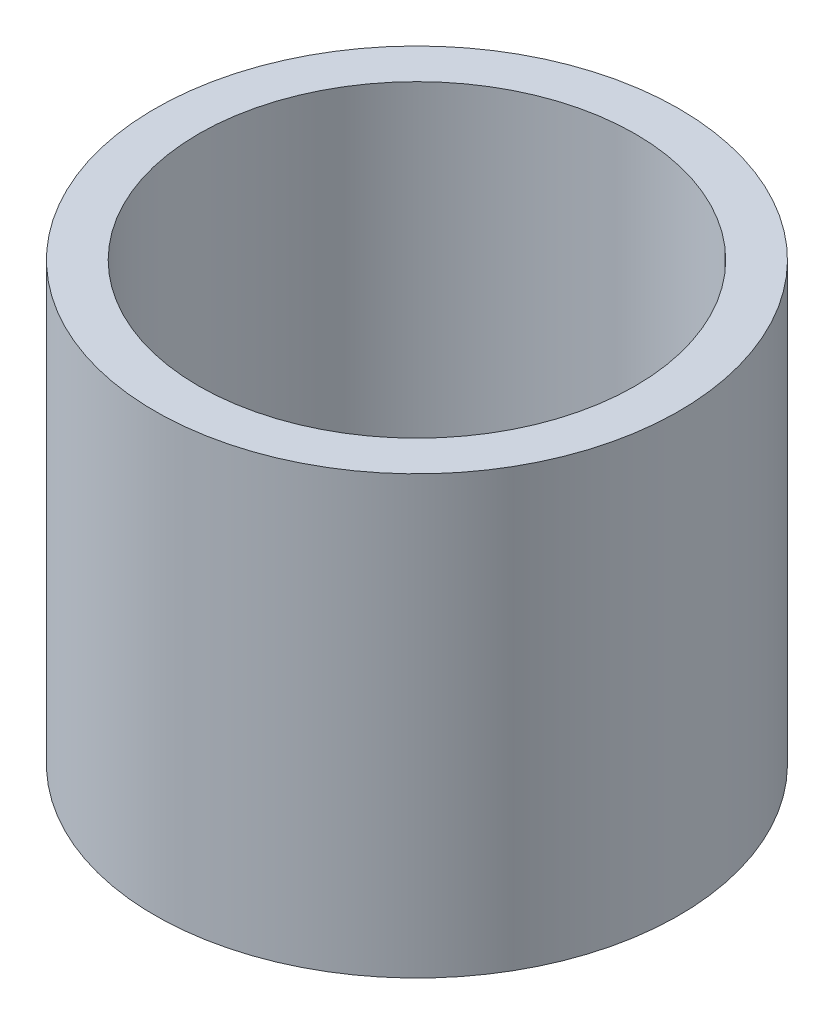
ISO-10303-21;
HEADER;
FILE_DESCRIPTION(('STEP AP214'),'2;1');
FILE_NAME('part.step','',(''),(''),'','','');
FILE_SCHEMA(('AUTOMOTIVE_DESIGN { 1 0 10303 214 1 1 1 1 }'));
ENDSEC;
DATA;
#1=APPLICATION_CONTEXT('core data for automotive mechanical design processes');
#2=APPLICATION_PROTOCOL_DEFINITION('international standard','automotive_design',2000,#1);
#3=PRODUCT_CONTEXT('',#1,'mechanical');
#4=PRODUCT('Part','Part','',(#3));
#5=PRODUCT_RELATED_PRODUCT_CATEGORY('part','',(#4));
#6=PRODUCT_DEFINITION_FORMATION('','',#4);
#7=PRODUCT_DEFINITION_CONTEXT('part definition',#1,'design');
#8=PRODUCT_DEFINITION('design','',#6,#7);
#9=PRODUCT_DEFINITION_SHAPE('','',#8);
#10=(LENGTH_UNIT() NAMED_UNIT(*) SI_UNIT(.MILLI.,.METRE.));
#11=(NAMED_UNIT(*) PLANE_ANGLE_UNIT() SI_UNIT($,.RADIAN.));
#12=(NAMED_UNIT(*) SI_UNIT($,.STERADIAN.) SOLID_ANGLE_UNIT());
#13=UNCERTAINTY_MEASURE_WITH_UNIT(LENGTH_MEASURE(1.E-05),#10,'distance_accuracy_value','');
#14=(GEOMETRIC_REPRESENTATION_CONTEXT(3) GLOBAL_UNCERTAINTY_ASSIGNED_CONTEXT((#13)) GLOBAL_UNIT_ASSIGNED_CONTEXT((#10,
#11,#12)) REPRESENTATION_CONTEXT('',''));
#15=CARTESIAN_POINT('',(0.,0.,0.));
#16=DIRECTION('',(0.,0.,1.));
#17=DIRECTION('',(1.,0.,0.));
#18=AXIS2_PLACEMENT_3D('',#15,#16,#17);
#19=CARTESIAN_POINT('',(0.,19.05,0.));
#20=DIRECTION('',(0.,1.,0.));
#21=DIRECTION('',(0.,0.,1.));
#22=AXIS2_PLACEMENT_3D('',#19,#20,#21);
#23=PLANE('',#22);
#24=CARTESIAN_POINT('',(0.,19.05,0.));
#25=DIRECTION('',(0.,1.,0.));
#26=DIRECTION('',(0.,0.,1.));
#27=AXIS2_PLACEMENT_3D('',#24,#25,#26);
#28=CIRCLE('',#27,11.43);
#29=CARTESIAN_POINT('',(0.,19.05,-11.43));
#30=VERTEX_POINT('',#29);
#31=EDGE_CURVE('E10',#30,#30,#28,.T.);
#32=ORIENTED_EDGE('',*,*,#31,.T.);
#33=EDGE_LOOP('',(#32));
#34=FACE_BOUND('',#33,.T.);
#35=CARTESIAN_POINT('',(0.,19.05,0.));
#36=DIRECTION('',(0.,1.,0.));
#37=DIRECTION('',(0.,0.,1.));
#38=AXIS2_PLACEMENT_3D('',#35,#36,#37);
#39=CIRCLE('',#38,9.525);
#40=CARTESIAN_POINT('',(0.,19.05,-9.525));
#41=VERTEX_POINT('',#40);
#42=EDGE_CURVE('E42',#41,#41,#39,.T.);
#43=ORIENTED_EDGE('',*,*,#42,.F.);
#44=EDGE_LOOP('',(#43));
#45=FACE_BOUND('',#44,.T.);
#46=ADVANCED_FACE('F31',(#34,#45),#23,.T.);
#47=CARTESIAN_POINT('',(0.,0.,0.));
#48=DIRECTION('',(0.,1.,0.));
#49=DIRECTION('',(0.,0.,1.));
#50=AXIS2_PLACEMENT_3D('',#47,#48,#49);
#51=PLANE('',#50);
#52=CARTESIAN_POINT('',(0.,0.,0.));
#53=DIRECTION('',(0.,1.,0.));
#54=DIRECTION('',(0.,0.,1.));
#55=AXIS2_PLACEMENT_3D('',#52,#53,#54);
#56=CIRCLE('',#55,11.43);
#57=CARTESIAN_POINT('',(0.,0.,-11.43));
#58=VERTEX_POINT('',#57);
#59=EDGE_CURVE('E35',#58,#58,#56,.T.);
#60=ORIENTED_EDGE('',*,*,#59,.F.);
#61=EDGE_LOOP('',(#60));
#62=FACE_BOUND('',#61,.T.);
#63=CARTESIAN_POINT('',(0.,0.,0.));
#64=DIRECTION('',(0.,1.,0.));
#65=DIRECTION('',(0.,0.,1.));
#66=AXIS2_PLACEMENT_3D('',#63,#64,#65);
#67=CIRCLE('',#66,9.525);
#68=CARTESIAN_POINT('',(0.,0.,-9.525));
#69=VERTEX_POINT('',#68);
#70=EDGE_CURVE('E44',#69,#69,#67,.T.);
#71=ORIENTED_EDGE('',*,*,#70,.T.);
#72=EDGE_LOOP('',(#71));
#73=FACE_BOUND('',#72,.T.);
#74=ADVANCED_FACE('F54',(#62,#73),#51,.F.);
#75=CARTESIAN_POINT('',(0.,19.05,0.));
#76=DIRECTION('',(0.,-1.,0.));
#77=DIRECTION('',(0.,0.,-1.));
#78=AXIS2_PLACEMENT_3D('',#75,#76,#77);
#79=CYLINDRICAL_SURFACE('',#78,11.43);
#80=CARTESIAN_POINT('',(0.,19.05,-11.43));
#81=CARTESIAN_POINT('',(0.,18.8515625,-11.43));
#82=CARTESIAN_POINT('',(0.,18.653125,-11.43));
#83=CARTESIAN_POINT('',(0.,18.25625,-11.43));
#84=CARTESIAN_POINT('',(0.,18.0578125,-11.43));
#85=CARTESIAN_POINT('',(0.,17.6609375,-11.43));
#86=CARTESIAN_POINT('',(0.,17.4625,-11.43));
#87=CARTESIAN_POINT('',(0.,17.065625,-11.43));
#88=CARTESIAN_POINT('',(0.,16.8671875,-11.43));
#89=CARTESIAN_POINT('',(0.,16.4703125,-11.43));
#90=CARTESIAN_POINT('',(0.,16.271875,-11.43));
#91=CARTESIAN_POINT('',(0.,15.875,-11.43));
#92=CARTESIAN_POINT('',(0.,15.6765625,-11.43));
#93=CARTESIAN_POINT('',(0.,15.2796875,-11.43));
#94=CARTESIAN_POINT('',(0.,15.08125,-11.43));
#95=CARTESIAN_POINT('',(0.,14.684375,-11.43));
#96=CARTESIAN_POINT('',(0.,14.4859375,-11.43));
#97=CARTESIAN_POINT('',(0.,14.0890625,-11.43));
#98=CARTESIAN_POINT('',(0.,13.890625,-11.43));
#99=CARTESIAN_POINT('',(0.,13.49375,-11.43));
#100=CARTESIAN_POINT('',(0.,13.2953125,-11.43));
#101=CARTESIAN_POINT('',(0.,12.8984375,-11.43));
#102=CARTESIAN_POINT('',(0.,12.7,-11.43));
#103=CARTESIAN_POINT('',(0.,12.303125,-11.43));
#104=CARTESIAN_POINT('',(0.,12.1046875,-11.43));
#105=CARTESIAN_POINT('',(0.,11.7078125,-11.43));
#106=CARTESIAN_POINT('',(0.,11.509375,-11.43));
#107=CARTESIAN_POINT('',(0.,11.1125,-11.43));
#108=CARTESIAN_POINT('',(0.,10.9140625,-11.43));
#109=CARTESIAN_POINT('',(0.,10.5171875,-11.43));
#110=CARTESIAN_POINT('',(0.,10.31875,-11.43));
#111=CARTESIAN_POINT('',(0.,9.921875,-11.43));
#112=CARTESIAN_POINT('',(0.,9.7234375,-11.43));
#113=CARTESIAN_POINT('',(0.,9.3265625,-11.43));
#114=CARTESIAN_POINT('',(0.,9.128125,-11.43));
#115=CARTESIAN_POINT('',(0.,8.73125,-11.43));
#116=CARTESIAN_POINT('',(0.,8.5328125,-11.43));
#117=CARTESIAN_POINT('',(0.,8.1359375,-11.43));
#118=CARTESIAN_POINT('',(0.,7.9375,-11.43));
#119=CARTESIAN_POINT('',(0.,7.540625,-11.43));
#120=CARTESIAN_POINT('',(0.,7.3421875,-11.43));
#121=CARTESIAN_POINT('',(0.,6.9453125,-11.43));
#122=CARTESIAN_POINT('',(0.,6.746875,-11.43));
#123=CARTESIAN_POINT('',(0.,6.35,-11.43));
#124=CARTESIAN_POINT('',(0.,6.1515625,-11.43));
#125=CARTESIAN_POINT('',(0.,5.7546875,-11.43));
#126=CARTESIAN_POINT('',(0.,5.55625,-11.43));
#127=CARTESIAN_POINT('',(0.,5.159375,-11.43));
#128=CARTESIAN_POINT('',(0.,4.9609375,-11.43));
#129=CARTESIAN_POINT('',(0.,4.5640625,-11.43));
#130=CARTESIAN_POINT('',(0.,4.365625,-11.43));
#131=CARTESIAN_POINT('',(0.,3.96875,-11.43));
#132=CARTESIAN_POINT('',(0.,3.7703125,-11.43));
#133=CARTESIAN_POINT('',(0.,3.3734375,-11.43));
#134=CARTESIAN_POINT('',(0.,3.175,-11.43));
#135=CARTESIAN_POINT('',(0.,2.778125,-11.43));
#136=CARTESIAN_POINT('',(0.,2.5796875,-11.43));
#137=CARTESIAN_POINT('',(0.,2.1828125,-11.43));
#138=CARTESIAN_POINT('',(0.,1.984375,-11.43));
#139=CARTESIAN_POINT('',(0.,1.5875,-11.43));
#140=CARTESIAN_POINT('',(0.,1.3890625,-11.43));
#141=CARTESIAN_POINT('',(0.,0.992187500000001,-11.43));
#142=CARTESIAN_POINT('',(0.,0.793750000000001,-11.43));
#143=CARTESIAN_POINT('',(0.,0.396875,-11.43));
#144=CARTESIAN_POINT('',(0.,0.1984375,-11.43));
#145=CARTESIAN_POINT('',(0.,0.,-11.43));
#146=B_SPLINE_CURVE_WITH_KNOTS('',3,(#80,#81,#82,#83,#84,#85,#86,#87,#88,#89,#90,#91,#92,#93,
#94,#95,#96,#97,#98,#99,#100,#101,#102,#103,#104,#105,#106,#107,#108,#109,#110,#111,#112,#113,
#114,#115,#116,#117,#118,#119,#120,#121,#122,#123,#124,#125,#126,#127,#128,#129,#130,#131,#132,
#133,#134,#135,#136,#137,#138,#139,#140,#141,#142,#143,#144,#145),.UNSPECIFIED.,.F.,.F.,(4,2,2,
2,2,2,2,2,2,2,2,2,2,2,2,2,2,2,2,2,2,2,2,2,2,2,2,2,2,2,2,2,4),(0.,0.595312499999997,1.190625,
1.7859375,2.38125,2.9765625,3.571875,4.1671875,4.7625,5.3578125,5.953125,6.5484375,7.14375,
7.7390625,8.334375,8.9296875,9.525,10.1203125,10.715625,11.3109375,11.90625,12.5015625,
13.096875,13.6921875,14.2875,14.8828125,15.478125,16.0734375,16.66875,17.2640625,17.859375,
18.4546875,19.05),.UNSPECIFIED.);
#147=EDGE_CURVE('BSEAM33',#30,#58,#146,.T.);
#148=ORIENTED_EDGE('',*,*,#31,.F.);
#149=ORIENTED_EDGE('',*,*,#59,.T.);
#150=ORIENTED_EDGE('',*,*,#147,.T.);
#151=ORIENTED_EDGE('',*,*,#147,.F.);
#152=EDGE_LOOP('',(#148,#150,#149,#151));
#153=FACE_BOUND('',#152,.T.);
#154=ADVANCED_FACE('F33',(#153),#79,.T.);
#155=CARTESIAN_POINT('',(0.,19.05,0.));
#156=DIRECTION('',(0.,-1.,0.));
#157=DIRECTION('',(0.,0.,-1.));
#158=AXIS2_PLACEMENT_3D('',#155,#156,#157);
#159=CYLINDRICAL_SURFACE('',#158,9.525);
#160=CARTESIAN_POINT('',(0.,19.05,-9.525));
#161=CARTESIAN_POINT('',(0.,18.8515625,-9.525));
#162=CARTESIAN_POINT('',(0.,18.653125,-9.525));
#163=CARTESIAN_POINT('',(0.,18.25625,-9.525));
#164=CARTESIAN_POINT('',(0.,18.0578125,-9.525));
#165=CARTESIAN_POINT('',(0.,17.6609375,-9.525));
#166=CARTESIAN_POINT('',(0.,17.4625,-9.525));
#167=CARTESIAN_POINT('',(0.,17.065625,-9.525));
#168=CARTESIAN_POINT('',(0.,16.8671875,-9.525));
#169=CARTESIAN_POINT('',(0.,16.4703125,-9.525));
#170=CARTESIAN_POINT('',(0.,16.271875,-9.525));
#171=CARTESIAN_POINT('',(0.,15.875,-9.525));
#172=CARTESIAN_POINT('',(0.,15.6765625,-9.525));
#173=CARTESIAN_POINT('',(0.,15.2796875,-9.525));
#174=CARTESIAN_POINT('',(0.,15.08125,-9.525));
#175=CARTESIAN_POINT('',(0.,14.684375,-9.525));
#176=CARTESIAN_POINT('',(0.,14.4859375,-9.525));
#177=CARTESIAN_POINT('',(0.,14.0890625,-9.525));
#178=CARTESIAN_POINT('',(0.,13.890625,-9.525));
#179=CARTESIAN_POINT('',(0.,13.49375,-9.525));
#180=CARTESIAN_POINT('',(0.,13.2953125,-9.525));
#181=CARTESIAN_POINT('',(0.,12.8984375,-9.525));
#182=CARTESIAN_POINT('',(0.,12.7,-9.525));
#183=CARTESIAN_POINT('',(0.,12.303125,-9.525));
#184=CARTESIAN_POINT('',(0.,12.1046875,-9.525));
#185=CARTESIAN_POINT('',(0.,11.7078125,-9.525));
#186=CARTESIAN_POINT('',(0.,11.509375,-9.525));
#187=CARTESIAN_POINT('',(0.,11.1125,-9.525));
#188=CARTESIAN_POINT('',(0.,10.9140625,-9.525));
#189=CARTESIAN_POINT('',(0.,10.5171875,-9.525));
#190=CARTESIAN_POINT('',(0.,10.31875,-9.525));
#191=CARTESIAN_POINT('',(0.,9.921875,-9.525));
#192=CARTESIAN_POINT('',(0.,9.7234375,-9.525));
#193=CARTESIAN_POINT('',(0.,9.3265625,-9.525));
#194=CARTESIAN_POINT('',(0.,9.128125,-9.525));
#195=CARTESIAN_POINT('',(0.,8.73125,-9.525));
#196=CARTESIAN_POINT('',(0.,8.5328125,-9.525));
#197=CARTESIAN_POINT('',(0.,8.1359375,-9.525));
#198=CARTESIAN_POINT('',(0.,7.9375,-9.525));
#199=CARTESIAN_POINT('',(0.,7.540625,-9.525));
#200=CARTESIAN_POINT('',(0.,7.3421875,-9.525));
#201=CARTESIAN_POINT('',(0.,6.9453125,-9.525));
#202=CARTESIAN_POINT('',(0.,6.746875,-9.525));
#203=CARTESIAN_POINT('',(0.,6.35,-9.525));
#204=CARTESIAN_POINT('',(0.,6.1515625,-9.525));
#205=CARTESIAN_POINT('',(0.,5.7546875,-9.525));
#206=CARTESIAN_POINT('',(0.,5.55625,-9.525));
#207=CARTESIAN_POINT('',(0.,5.159375,-9.525));
#208=CARTESIAN_POINT('',(0.,4.9609375,-9.525));
#209=CARTESIAN_POINT('',(0.,4.5640625,-9.525));
#210=CARTESIAN_POINT('',(0.,4.365625,-9.525));
#211=CARTESIAN_POINT('',(0.,3.96875,-9.525));
#212=CARTESIAN_POINT('',(0.,3.7703125,-9.525));
#213=CARTESIAN_POINT('',(0.,3.3734375,-9.525));
#214=CARTESIAN_POINT('',(0.,3.175,-9.525));
#215=CARTESIAN_POINT('',(0.,2.778125,-9.525));
#216=CARTESIAN_POINT('',(0.,2.5796875,-9.525));
#217=CARTESIAN_POINT('',(0.,2.1828125,-9.525));
#218=CARTESIAN_POINT('',(0.,1.984375,-9.525));
#219=CARTESIAN_POINT('',(0.,1.5875,-9.525));
#220=CARTESIAN_POINT('',(0.,1.3890625,-9.525));
#221=CARTESIAN_POINT('',(0.,0.992187500000001,-9.525));
#222=CARTESIAN_POINT('',(0.,0.793750000000001,-9.525));
#223=CARTESIAN_POINT('',(0.,0.396875,-9.525));
#224=CARTESIAN_POINT('',(0.,0.1984375,-9.525));
#225=CARTESIAN_POINT('',(0.,0.,-9.525));
#226=B_SPLINE_CURVE_WITH_KNOTS('',3,(#160,#161,#162,#163,#164,#165,#166,#167,#168,#169,#170,
#171,#172,#173,#174,#175,#176,#177,#178,#179,#180,#181,#182,#183,#184,#185,#186,#187,#188,#189,
#190,#191,#192,#193,#194,#195,#196,#197,#198,#199,#200,#201,#202,#203,#204,#205,#206,#207,#208,
#209,#210,#211,#212,#213,#214,#215,#216,#217,#218,#219,#220,#221,#222,#223,#224,#225),
.UNSPECIFIED.,.F.,.F.,(4,2,2,2,2,2,2,2,2,2,2,2,2,2,2,2,2,2,2,2,2,2,2,2,2,2,2,2,2,2,2,2,4),(0.,
0.5953125,1.190625,1.7859375,2.38125,2.9765625,3.571875,4.1671875,4.7625,5.3578125,5.953125,
6.5484375,7.14375,7.7390625,8.334375,8.9296875,9.525,10.1203125,10.715625,11.3109375,11.90625,
12.5015625,13.096875,13.6921875,14.2875,14.8828125,15.478125,16.0734375,16.66875,17.2640625,
17.859375,18.4546875,19.05),.UNSPECIFIED.);
#227=EDGE_CURVE('BSEAM50',#41,#69,#226,.T.);
#228=ORIENTED_EDGE('',*,*,#42,.T.);
#229=ORIENTED_EDGE('',*,*,#70,.F.);
#230=ORIENTED_EDGE('',*,*,#227,.T.);
#231=ORIENTED_EDGE('',*,*,#227,.F.);
#232=EDGE_LOOP('',(#228,#230,#229,#231));
#233=FACE_BOUND('',#232,.T.);
#234=ADVANCED_FACE('F50',(#233),#159,.F.);
#235=CLOSED_SHELL('',(#46,#74,#154,#234));
#236=MANIFOLD_SOLID_BREP('B2',#235);
#237=ADVANCED_BREP_SHAPE_REPRESENTATION('',(#18,#236),#14);
#238=SHAPE_DEFINITION_REPRESENTATION(#9,#237);
ENDSEC;
END-ISO-10303-21;
